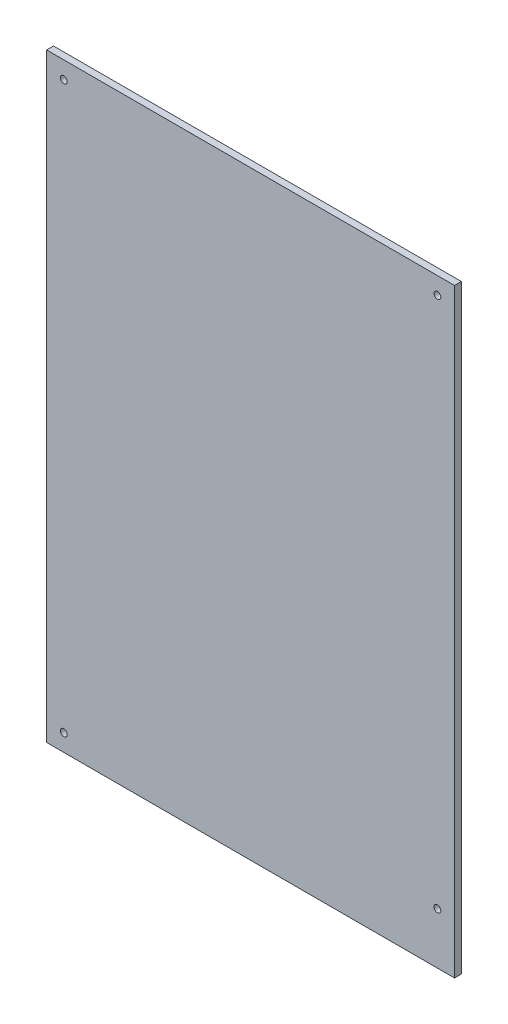
ISO-10303-21;
HEADER;
FILE_DESCRIPTION(('STEP AP214'),'2;1');
FILE_NAME('part.step','',(''),(''),'','','');
FILE_SCHEMA(('AUTOMOTIVE_DESIGN { 1 0 10303 214 1 1 1 1 }'));
ENDSEC;
DATA;
#1=APPLICATION_CONTEXT('core data for automotive mechanical design processes');
#2=APPLICATION_PROTOCOL_DEFINITION('international standard','automotive_design',2000,#1);
#3=PRODUCT_CONTEXT('',#1,'mechanical');
#4=PRODUCT('Part','Part','',(#3));
#5=PRODUCT_RELATED_PRODUCT_CATEGORY('part','',(#4));
#6=PRODUCT_DEFINITION_FORMATION('','',#4);
#7=PRODUCT_DEFINITION_CONTEXT('part definition',#1,'design');
#8=PRODUCT_DEFINITION('design','',#6,#7);
#9=PRODUCT_DEFINITION_SHAPE('','',#8);
#10=(LENGTH_UNIT() NAMED_UNIT(*) SI_UNIT(.MILLI.,.METRE.));
#11=(NAMED_UNIT(*) PLANE_ANGLE_UNIT() SI_UNIT($,.RADIAN.));
#12=(NAMED_UNIT(*) SI_UNIT($,.STERADIAN.) SOLID_ANGLE_UNIT());
#13=UNCERTAINTY_MEASURE_WITH_UNIT(LENGTH_MEASURE(1.E-05),#10,'distance_accuracy_value','');
#14=(GEOMETRIC_REPRESENTATION_CONTEXT(3) GLOBAL_UNCERTAINTY_ASSIGNED_CONTEXT((#13)) GLOBAL_UNIT_ASSIGNED_CONTEXT((#10,
#11,#12)) REPRESENTATION_CONTEXT('',''));
#15=CARTESIAN_POINT('',(0.,0.,0.));
#16=DIRECTION('',(0.,0.,1.));
#17=DIRECTION('',(1.,0.,0.));
#18=AXIS2_PLACEMENT_3D('',#15,#16,#17);
#19=CARTESIAN_POINT('',(0.,0.,4.));
#20=DIRECTION('',(0.,0.,1.));
#21=DIRECTION('',(1.,0.,0.));
#22=AXIS2_PLACEMENT_3D('',#19,#20,#21);
#23=PLANE('',#22);
#24=CARTESIAN_POINT('',(-109.,165.,4.));
#25=DIRECTION('',(0.,0.,1.));
#26=DIRECTION('',(1.,0.,0.));
#27=AXIS2_PLACEMENT_3D('',#24,#25,#26);
#28=CIRCLE('',#27,2.);
#29=CARTESIAN_POINT('',(-107.,165.,4.));
#30=VERTEX_POINT('',#29);
#31=EDGE_CURVE('E121',#30,#30,#28,.T.);
#32=ORIENTED_EDGE('',*,*,#31,.F.);
#33=EDGE_LOOP('',(#32));
#34=FACE_BOUND('',#33,.T.);
#35=CARTESIAN_POINT('',(109.,165.,4.));
#36=DIRECTION('',(0.,0.,1.));
#37=DIRECTION('',(1.,0.,0.));
#38=AXIS2_PLACEMENT_3D('',#35,#36,#37);
#39=CIRCLE('',#38,2.);
#40=CARTESIAN_POINT('',(111.,165.,4.));
#41=VERTEX_POINT('',#40);
#42=EDGE_CURVE('E100',#41,#41,#39,.T.);
#43=ORIENTED_EDGE('',*,*,#42,.F.);
#44=EDGE_LOOP('',(#43));
#45=FACE_BOUND('',#44,.T.);
#46=DIRECTION('',(0.,-1.,0.));
#47=VECTOR('',#46,1.);
#48=CARTESIAN_POINT('',(-119.,-175.,4.));
#49=LINE('',#48,#47);
#50=CARTESIAN_POINT('',(-119.,175.,4.));
#51=VERTEX_POINT('',#50);
#52=CARTESIAN_POINT('',(-119.,-175.,4.));
#53=VERTEX_POINT('',#52);
#54=EDGE_CURVE('E85',#51,#53,#49,.T.);
#55=ORIENTED_EDGE('',*,*,#54,.T.);
#56=DIRECTION('',(1.,0.,0.));
#57=VECTOR('',#56,1.);
#58=CARTESIAN_POINT('',(119.,-175.,4.));
#59=LINE('',#58,#57);
#60=CARTESIAN_POINT('',(119.,-175.,4.));
#61=VERTEX_POINT('',#60);
#62=EDGE_CURVE('E80',#53,#61,#59,.T.);
#63=ORIENTED_EDGE('',*,*,#62,.T.);
#64=DIRECTION('',(0.,1.,0.));
#65=VECTOR('',#64,1.);
#66=CARTESIAN_POINT('',(119.,-175.,4.));
#67=LINE('',#66,#65);
#68=CARTESIAN_POINT('',(119.,175.,4.));
#69=VERTEX_POINT('',#68);
#70=EDGE_CURVE('E83',#61,#69,#67,.T.);
#71=ORIENTED_EDGE('',*,*,#70,.T.);
#72=DIRECTION('',(-1.,0.,0.));
#73=VECTOR('',#72,1.);
#74=CARTESIAN_POINT('',(119.,175.,4.));
#75=LINE('',#74,#73);
#76=EDGE_CURVE('E50',#69,#51,#75,.T.);
#77=ORIENTED_EDGE('',*,*,#76,.T.);
#78=EDGE_LOOP('',(#55,#63,#71,#77));
#79=FACE_BOUND('',#78,.T.);
#80=CARTESIAN_POINT('',(109.,-145.,4.));
#81=DIRECTION('',(0.,0.,1.));
#82=DIRECTION('',(1.,0.,0.));
#83=AXIS2_PLACEMENT_3D('',#80,#81,#82);
#84=CIRCLE('',#83,2.);
#85=CARTESIAN_POINT('',(111.,-145.,4.));
#86=VERTEX_POINT('',#85);
#87=EDGE_CURVE('E115',#86,#86,#84,.T.);
#88=ORIENTED_EDGE('',*,*,#87,.F.);
#89=EDGE_LOOP('',(#88));
#90=FACE_BOUND('',#89,.T.);
#91=CARTESIAN_POINT('',(-109.,-165.,4.));
#92=DIRECTION('',(0.,0.,1.));
#93=DIRECTION('',(1.,0.,0.));
#94=AXIS2_PLACEMENT_3D('',#91,#92,#93);
#95=CIRCLE('',#94,2.);
#96=CARTESIAN_POINT('',(-107.,-165.,4.));
#97=VERTEX_POINT('',#96);
#98=EDGE_CURVE('E127',#97,#97,#95,.T.);
#99=ORIENTED_EDGE('',*,*,#98,.F.);
#100=EDGE_LOOP('',(#99));
#101=FACE_BOUND('',#100,.T.);
#102=ADVANCED_FACE('F33',(#34,#45,#79,#90,#101),#23,.T.);
#103=CARTESIAN_POINT('',(0.,0.,0.));
#104=DIRECTION('',(0.,0.,1.));
#105=DIRECTION('',(1.,0.,0.));
#106=AXIS2_PLACEMENT_3D('',#103,#104,#105);
#107=PLANE('',#106);
#108=DIRECTION('',(0.,-1.,0.));
#109=VECTOR('',#108,1.);
#110=CARTESIAN_POINT('',(-119.,-175.,0.));
#111=LINE('',#110,#109);
#112=CARTESIAN_POINT('',(-119.,175.,0.));
#113=VERTEX_POINT('',#112);
#114=CARTESIAN_POINT('',(-119.,-175.,0.));
#115=VERTEX_POINT('',#114);
#116=EDGE_CURVE('E97',#113,#115,#111,.T.);
#117=ORIENTED_EDGE('',*,*,#116,.F.);
#118=DIRECTION('',(-1.,0.,0.));
#119=VECTOR('',#118,1.);
#120=CARTESIAN_POINT('',(119.,175.,0.));
#121=LINE('',#120,#119);
#122=CARTESIAN_POINT('',(119.,175.,0.));
#123=VERTEX_POINT('',#122);
#124=EDGE_CURVE('E73',#123,#113,#121,.T.);
#125=ORIENTED_EDGE('',*,*,#124,.F.);
#126=DIRECTION('',(0.,1.,0.));
#127=VECTOR('',#126,1.);
#128=CARTESIAN_POINT('',(119.,-175.,0.));
#129=LINE('',#128,#127);
#130=CARTESIAN_POINT('',(119.,-175.,0.));
#131=VERTEX_POINT('',#130);
#132=EDGE_CURVE('E67',#131,#123,#129,.T.);
#133=ORIENTED_EDGE('',*,*,#132,.F.);
#134=DIRECTION('',(1.,0.,0.));
#135=VECTOR('',#134,1.);
#136=CARTESIAN_POINT('',(119.,-175.,0.));
#137=LINE('',#136,#135);
#138=EDGE_CURVE('E89',#115,#131,#137,.T.);
#139=ORIENTED_EDGE('',*,*,#138,.F.);
#140=EDGE_LOOP('',(#117,#125,#133,#139));
#141=FACE_BOUND('',#140,.T.);
#142=CARTESIAN_POINT('',(109.,165.,0.));
#143=DIRECTION('',(0.,0.,1.));
#144=DIRECTION('',(1.,0.,0.));
#145=AXIS2_PLACEMENT_3D('',#142,#143,#144);
#146=CIRCLE('',#145,2.);
#147=CARTESIAN_POINT('',(111.,165.,0.));
#148=VERTEX_POINT('',#147);
#149=EDGE_CURVE('E112',#148,#148,#146,.T.);
#150=ORIENTED_EDGE('',*,*,#149,.T.);
#151=EDGE_LOOP('',(#150));
#152=FACE_BOUND('',#151,.T.);
#153=CARTESIAN_POINT('',(109.,-145.,0.));
#154=DIRECTION('',(0.,0.,1.));
#155=DIRECTION('',(1.,0.,0.));
#156=AXIS2_PLACEMENT_3D('',#153,#154,#155);
#157=CIRCLE('',#156,2.);
#158=CARTESIAN_POINT('',(111.,-145.,0.));
#159=VERTEX_POINT('',#158);
#160=EDGE_CURVE('E118',#159,#159,#157,.T.);
#161=ORIENTED_EDGE('',*,*,#160,.T.);
#162=EDGE_LOOP('',(#161));
#163=FACE_BOUND('',#162,.T.);
#164=CARTESIAN_POINT('',(-109.,165.,0.));
#165=DIRECTION('',(0.,0.,1.));
#166=DIRECTION('',(1.,0.,0.));
#167=AXIS2_PLACEMENT_3D('',#164,#165,#166);
#168=CIRCLE('',#167,2.);
#169=CARTESIAN_POINT('',(-107.,165.,0.));
#170=VERTEX_POINT('',#169);
#171=EDGE_CURVE('E124',#170,#170,#168,.T.);
#172=ORIENTED_EDGE('',*,*,#171,.T.);
#173=EDGE_LOOP('',(#172));
#174=FACE_BOUND('',#173,.T.);
#175=CARTESIAN_POINT('',(-109.,-165.,0.));
#176=DIRECTION('',(0.,0.,1.));
#177=DIRECTION('',(1.,0.,0.));
#178=AXIS2_PLACEMENT_3D('',#175,#176,#177);
#179=CIRCLE('',#178,2.);
#180=CARTESIAN_POINT('',(-107.,-165.,0.));
#181=VERTEX_POINT('',#180);
#182=EDGE_CURVE('E130',#181,#181,#179,.T.);
#183=ORIENTED_EDGE('',*,*,#182,.T.);
#184=EDGE_LOOP('',(#183));
#185=FACE_BOUND('',#184,.T.);
#186=ADVANCED_FACE('F108',(#141,#152,#163,#174,#185),#107,.F.);
#187=CARTESIAN_POINT('',(-119.,-175.,4.));
#188=DIRECTION('',(1.,0.,0.));
#189=DIRECTION('',(0.,0.,-1.));
#190=AXIS2_PLACEMENT_3D('',#187,#188,#189);
#191=PLANE('',#190);
#192=ORIENTED_EDGE('',*,*,#116,.T.);
#193=DIRECTION('',(0.,0.,-1.));
#194=VECTOR('',#193,1.);
#195=CARTESIAN_POINT('',(-119.,-175.,4.));
#196=LINE('',#195,#194);
#197=EDGE_CURVE('E11',#53,#115,#196,.T.);
#198=ORIENTED_EDGE('',*,*,#197,.F.);
#199=ORIENTED_EDGE('',*,*,#54,.F.);
#200=DIRECTION('',(0.,0.,-1.));
#201=VECTOR('',#200,1.);
#202=CARTESIAN_POINT('',(-119.,175.,4.));
#203=LINE('',#202,#201);
#204=EDGE_CURVE('E93',#51,#113,#203,.T.);
#205=ORIENTED_EDGE('',*,*,#204,.T.);
#206=EDGE_LOOP('',(#192,#198,#199,#205));
#207=FACE_BOUND('',#206,.T.);
#208=ADVANCED_FACE('F35',(#207),#191,.F.);
#209=CARTESIAN_POINT('',(119.,-175.,4.));
#210=DIRECTION('',(0.,1.,0.));
#211=DIRECTION('',(-1.,0.,0.));
#212=AXIS2_PLACEMENT_3D('',#209,#210,#211);
#213=PLANE('',#212);
#214=ORIENTED_EDGE('',*,*,#138,.T.);
#215=DIRECTION('',(0.,0.,-1.));
#216=VECTOR('',#215,1.);
#217=CARTESIAN_POINT('',(119.,-175.,4.));
#218=LINE('',#217,#216);
#219=EDGE_CURVE('E42',#61,#131,#218,.T.);
#220=ORIENTED_EDGE('',*,*,#219,.F.);
#221=ORIENTED_EDGE('',*,*,#62,.F.);
#222=ORIENTED_EDGE('',*,*,#197,.T.);
#223=EDGE_LOOP('',(#214,#220,#221,#222));
#224=FACE_BOUND('',#223,.T.);
#225=ADVANCED_FACE('F88',(#224),#213,.F.);
#226=CARTESIAN_POINT('',(119.,-175.,4.));
#227=DIRECTION('',(-1.,0.,0.));
#228=DIRECTION('',(0.,0.,1.));
#229=AXIS2_PLACEMENT_3D('',#226,#227,#228);
#230=PLANE('',#229);
#231=ORIENTED_EDGE('',*,*,#132,.T.);
#232=DIRECTION('',(0.,0.,-1.));
#233=VECTOR('',#232,1.);
#234=CARTESIAN_POINT('',(119.,175.,4.));
#235=LINE('',#234,#233);
#236=EDGE_CURVE('E90',#69,#123,#235,.T.);
#237=ORIENTED_EDGE('',*,*,#236,.F.);
#238=ORIENTED_EDGE('',*,*,#70,.F.);
#239=ORIENTED_EDGE('',*,*,#219,.T.);
#240=EDGE_LOOP('',(#231,#237,#238,#239));
#241=FACE_BOUND('',#240,.T.);
#242=ADVANCED_FACE('F91',(#241),#230,.F.);
#243=CARTESIAN_POINT('',(119.,175.,4.));
#244=DIRECTION('',(0.,-1.,0.));
#245=DIRECTION('',(1.,0.,0.));
#246=AXIS2_PLACEMENT_3D('',#243,#244,#245);
#247=PLANE('',#246);
#248=ORIENTED_EDGE('',*,*,#124,.T.);
#249=ORIENTED_EDGE('',*,*,#204,.F.);
#250=ORIENTED_EDGE('',*,*,#76,.F.);
#251=ORIENTED_EDGE('',*,*,#236,.T.);
#252=EDGE_LOOP('',(#248,#249,#250,#251));
#253=FACE_BOUND('',#252,.T.);
#254=ADVANCED_FACE('F105',(#253),#247,.F.);
#255=CARTESIAN_POINT('',(109.,165.,4.));
#256=DIRECTION('',(0.,0.,-1.));
#257=DIRECTION('',(-1.,0.,0.));
#258=AXIS2_PLACEMENT_3D('',#255,#256,#257);
#259=CYLINDRICAL_SURFACE('',#258,2.);
#260=ORIENTED_EDGE('',*,*,#42,.T.);
#261=EDGE_LOOP('',(#260));
#262=FACE_BOUND('',#261,.T.);
#263=ORIENTED_EDGE('',*,*,#149,.F.);
#264=EDGE_LOOP('',(#263));
#265=FACE_BOUND('',#264,.T.);
#266=ADVANCED_FACE('F149',(#262,#265),#259,.F.);
#267=CARTESIAN_POINT('',(109.,-145.,4.));
#268=DIRECTION('',(0.,0.,-1.));
#269=DIRECTION('',(-1.,0.,0.));
#270=AXIS2_PLACEMENT_3D('',#267,#268,#269);
#271=CYLINDRICAL_SURFACE('',#270,2.);
#272=ORIENTED_EDGE('',*,*,#87,.T.);
#273=EDGE_LOOP('',(#272));
#274=FACE_BOUND('',#273,.T.);
#275=ORIENTED_EDGE('',*,*,#160,.F.);
#276=EDGE_LOOP('',(#275));
#277=FACE_BOUND('',#276,.T.);
#278=ADVANCED_FACE('F195',(#274,#277),#271,.F.);
#279=CARTESIAN_POINT('',(-109.,165.,4.));
#280=DIRECTION('',(0.,0.,-1.));
#281=DIRECTION('',(-1.,0.,0.));
#282=AXIS2_PLACEMENT_3D('',#279,#280,#281);
#283=CYLINDRICAL_SURFACE('',#282,2.);
#284=ORIENTED_EDGE('',*,*,#31,.T.);
#285=EDGE_LOOP('',(#284));
#286=FACE_BOUND('',#285,.T.);
#287=ORIENTED_EDGE('',*,*,#171,.F.);
#288=EDGE_LOOP('',(#287));
#289=FACE_BOUND('',#288,.T.);
#290=ADVANCED_FACE('F203',(#286,#289),#283,.F.);
#291=CARTESIAN_POINT('',(-109.,-165.,4.));
#292=DIRECTION('',(0.,0.,-1.));
#293=DIRECTION('',(-1.,0.,0.));
#294=AXIS2_PLACEMENT_3D('',#291,#292,#293);
#295=CYLINDRICAL_SURFACE('',#294,2.);
#296=ORIENTED_EDGE('',*,*,#98,.T.);
#297=EDGE_LOOP('',(#296));
#298=FACE_BOUND('',#297,.T.);
#299=ORIENTED_EDGE('',*,*,#182,.F.);
#300=EDGE_LOOP('',(#299));
#301=FACE_BOUND('',#300,.T.);
#302=ADVANCED_FACE('F136',(#298,#301),#295,.F.);
#303=CLOSED_SHELL('',(#102,#186,#208,#225,#242,#254,#266,#278,#290,#302));
#304=MANIFOLD_SOLID_BREP('B2',#303);
#305=ADVANCED_BREP_SHAPE_REPRESENTATION('',(#18,#304),#14);
#306=SHAPE_DEFINITION_REPRESENTATION(#9,#305);
ENDSEC;
END-ISO-10303-21;
